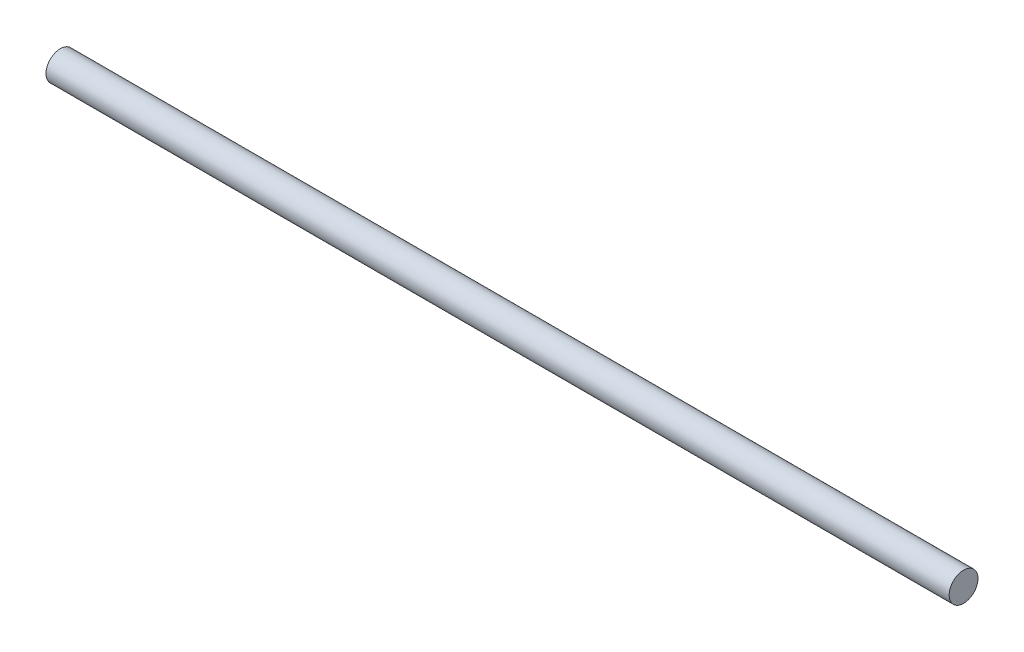
ISO-10303-21;
HEADER;
FILE_DESCRIPTION(('STEP AP214'),'2;1');
FILE_NAME('part.step','',(''),(''),'','','');
FILE_SCHEMA(('AUTOMOTIVE_DESIGN { 1 0 10303 214 1 1 1 1 }'));
ENDSEC;
DATA;
#1=APPLICATION_CONTEXT('core data for automotive mechanical design processes');
#2=APPLICATION_PROTOCOL_DEFINITION('international standard','automotive_design',2000,#1);
#3=PRODUCT_CONTEXT('',#1,'mechanical');
#4=PRODUCT('Part','Part','',(#3));
#5=PRODUCT_RELATED_PRODUCT_CATEGORY('part','',(#4));
#6=PRODUCT_DEFINITION_FORMATION('','',#4);
#7=PRODUCT_DEFINITION_CONTEXT('part definition',#1,'design');
#8=PRODUCT_DEFINITION('design','',#6,#7);
#9=PRODUCT_DEFINITION_SHAPE('','',#8);
#10=(LENGTH_UNIT() NAMED_UNIT(*) SI_UNIT(.MILLI.,.METRE.));
#11=(NAMED_UNIT(*) PLANE_ANGLE_UNIT() SI_UNIT($,.RADIAN.));
#12=(NAMED_UNIT(*) SI_UNIT($,.STERADIAN.) SOLID_ANGLE_UNIT());
#13=UNCERTAINTY_MEASURE_WITH_UNIT(LENGTH_MEASURE(1.E-05),#10,'distance_accuracy_value','');
#14=(GEOMETRIC_REPRESENTATION_CONTEXT(3) GLOBAL_UNCERTAINTY_ASSIGNED_CONTEXT((#13)) GLOBAL_UNIT_ASSIGNED_CONTEXT((#10,
#11,#12)) REPRESENTATION_CONTEXT('',''));
#15=CARTESIAN_POINT('',(0.,0.,0.));
#16=DIRECTION('',(0.,0.,1.));
#17=DIRECTION('',(1.,0.,0.));
#18=AXIS2_PLACEMENT_3D('',#15,#16,#17);
#19=CARTESIAN_POINT('',(298.45,0.,0.));
#20=DIRECTION('',(-1.,0.,0.));
#21=DIRECTION('',(0.,0.,1.));
#22=AXIS2_PLACEMENT_3D('',#19,#20,#21);
#23=CYLINDRICAL_SURFACE('',#22,4.7625);
#24=CARTESIAN_POINT('',(298.45,0.,0.));
#25=DIRECTION('',(1.,0.,0.));
#26=DIRECTION('',(0.,0.,-1.));
#27=AXIS2_PLACEMENT_3D('',#24,#25,#26);
#28=CIRCLE('',#27,4.7625);
#29=CARTESIAN_POINT('',(298.45,0.,-4.7625));
#30=VERTEX_POINT('',#29);
#31=EDGE_CURVE('E10',#30,#30,#28,.T.);
#32=ORIENTED_EDGE('',*,*,#31,.F.);
#33=EDGE_LOOP('',(#32));
#34=FACE_BOUND('',#33,.T.);
#35=CARTESIAN_POINT('',(0.,0.,0.));
#36=DIRECTION('',(1.,0.,0.));
#37=DIRECTION('',(0.,0.,-1.));
#38=AXIS2_PLACEMENT_3D('',#35,#36,#37);
#39=CIRCLE('',#38,4.7625);
#40=CARTESIAN_POINT('',(0.,0.,-4.7625));
#41=VERTEX_POINT('',#40);
#42=EDGE_CURVE('E33',#41,#41,#39,.T.);
#43=ORIENTED_EDGE('',*,*,#42,.T.);
#44=EDGE_LOOP('',(#43));
#45=FACE_BOUND('',#44,.T.);
#46=ADVANCED_FACE('F30',(#34,#45),#23,.T.);
#47=CARTESIAN_POINT('',(298.45,0.,0.));
#48=DIRECTION('',(1.,0.,0.));
#49=DIRECTION('',(0.,0.,-1.));
#50=AXIS2_PLACEMENT_3D('',#47,#48,#49);
#51=PLANE('',#50);
#52=ORIENTED_EDGE('',*,*,#31,.T.);
#53=EDGE_LOOP('',(#52));
#54=FACE_BOUND('',#53,.T.);
#55=ADVANCED_FACE('F45',(#54),#51,.T.);
#56=CARTESIAN_POINT('',(0.,0.,0.));
#57=DIRECTION('',(1.,0.,0.));
#58=DIRECTION('',(0.,0.,-1.));
#59=AXIS2_PLACEMENT_3D('',#56,#57,#58);
#60=PLANE('',#59);
#61=ORIENTED_EDGE('',*,*,#42,.F.);
#62=EDGE_LOOP('',(#61));
#63=FACE_BOUND('',#62,.T.);
#64=ADVANCED_FACE('F43',(#63),#60,.F.);
#65=CLOSED_SHELL('',(#46,#55,#64));
#66=MANIFOLD_SOLID_BREP('B2',#65);
#67=ADVANCED_BREP_SHAPE_REPRESENTATION('',(#18,#66),#14);
#68=SHAPE_DEFINITION_REPRESENTATION(#9,#67);
ENDSEC;
END-ISO-10303-21;
